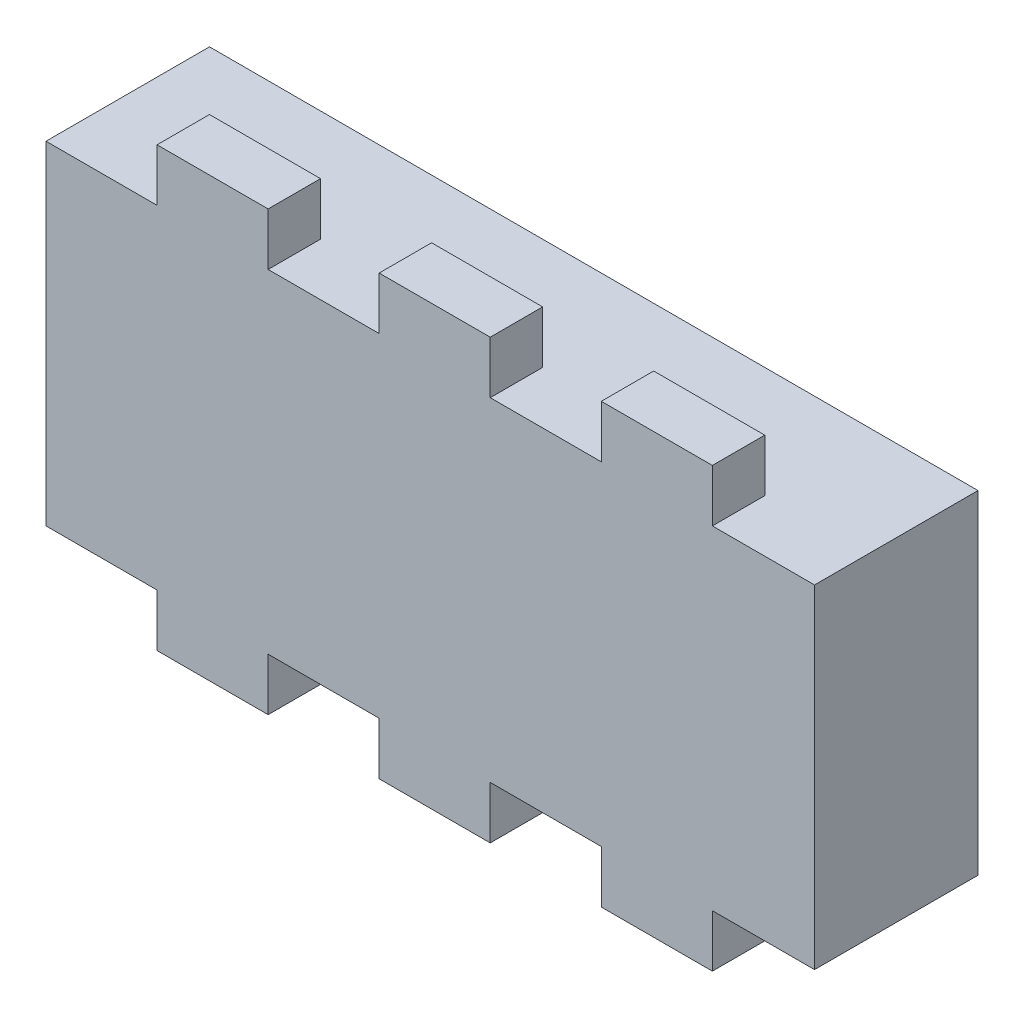
ISO-10303-21;
HEADER;
FILE_DESCRIPTION(('STEP AP214'),'2;1');
FILE_NAME('part.step','',(''),(''),'','','');
FILE_SCHEMA(('AUTOMOTIVE_DESIGN { 1 0 10303 214 1 1 1 1 }'));
ENDSEC;
DATA;
#1=APPLICATION_CONTEXT('core data for automotive mechanical design processes');
#2=APPLICATION_PROTOCOL_DEFINITION('international standard','automotive_design',2000,#1);
#3=PRODUCT_CONTEXT('',#1,'mechanical');
#4=PRODUCT('Part','Part','',(#3));
#5=PRODUCT_RELATED_PRODUCT_CATEGORY('part','',(#4));
#6=PRODUCT_DEFINITION_FORMATION('','',#4);
#7=PRODUCT_DEFINITION_CONTEXT('part definition',#1,'design');
#8=PRODUCT_DEFINITION('design','',#6,#7);
#9=PRODUCT_DEFINITION_SHAPE('','',#8);
#10=(LENGTH_UNIT() NAMED_UNIT(*) SI_UNIT(.MILLI.,.METRE.));
#11=(NAMED_UNIT(*) PLANE_ANGLE_UNIT() SI_UNIT($,.RADIAN.));
#12=(NAMED_UNIT(*) SI_UNIT($,.STERADIAN.) SOLID_ANGLE_UNIT());
#13=UNCERTAINTY_MEASURE_WITH_UNIT(LENGTH_MEASURE(1.E-05),#10,'distance_accuracy_value','');
#14=(GEOMETRIC_REPRESENTATION_CONTEXT(3) GLOBAL_UNCERTAINTY_ASSIGNED_CONTEXT((#13)) GLOBAL_UNIT_ASSIGNED_CONTEXT((#10,
#11,#12)) REPRESENTATION_CONTEXT('',''));
#15=CARTESIAN_POINT('',(0.,0.,0.));
#16=DIRECTION('',(0.,0.,1.));
#17=DIRECTION('',(1.,0.,0.));
#18=AXIS2_PLACEMENT_3D('',#15,#16,#17);
#19=CARTESIAN_POINT('',(0.,0.,-2.9972));
#20=DIRECTION('',(0.,0.,1.));
#21=DIRECTION('',(-1.,0.,0.));
#22=AXIS2_PLACEMENT_3D('',#19,#20,#21);
#23=PLANE('',#22);
#24=DIRECTION('',(-1.,0.,0.));
#25=VECTOR('',#24,1.);
#26=CARTESIAN_POINT('',(-21.971,9.525,-2.9972));
#27=LINE('',#26,#25);
#28=CARTESIAN_POINT('',(16.129,9.525,-2.9972));
#29=VERTEX_POINT('',#28);
#30=CARTESIAN_POINT('',(9.77899999999999,9.525,-2.9972));
#31=VERTEX_POINT('',#30);
#32=EDGE_CURVE('E11',#29,#31,#27,.T.);
#33=ORIENTED_EDGE('',*,*,#32,.T.);
#34=DIRECTION('',(0.,-1.,0.));
#35=VECTOR('',#34,1.);
#36=CARTESIAN_POINT('',(9.779,12.5222,-2.9972));
#37=LINE('',#36,#35);
#38=CARTESIAN_POINT('',(9.779,12.5222,-2.9972));
#39=VERTEX_POINT('',#38);
#40=EDGE_CURVE('E356',#39,#31,#37,.T.);
#41=ORIENTED_EDGE('',*,*,#40,.F.);
#42=DIRECTION('',(1.,0.,0.));
#43=VECTOR('',#42,1.);
#44=CARTESIAN_POINT('',(9.779,12.5222,-2.9972));
#45=LINE('',#44,#43);
#46=CARTESIAN_POINT('',(16.129,12.5222,-2.9972));
#47=VERTEX_POINT('',#46);
#48=EDGE_CURVE('E371',#39,#47,#45,.T.);
#49=ORIENTED_EDGE('',*,*,#48,.T.);
#50=DIRECTION('',(0.,-1.,0.));
#51=VECTOR('',#50,1.);
#52=CARTESIAN_POINT('',(16.129,12.5222,-2.9972));
#53=LINE('',#52,#51);
#54=EDGE_CURVE('E387',#47,#29,#53,.T.);
#55=ORIENTED_EDGE('',*,*,#54,.T.);
#56=EDGE_LOOP('',(#33,#41,#49,#55));
#57=FACE_BOUND('',#56,.T.);
#58=ADVANCED_FACE('F45',(#57),#23,.F.);
#59=CARTESIAN_POINT('',(3.42899999999999,9.525,-2.9972));
#60=VERTEX_POINT('',#59);
#61=CARTESIAN_POINT('',(-2.92100000000001,9.525,-2.9972));
#62=VERTEX_POINT('',#61);
#63=EDGE_CURVE('E54',#60,#62,#27,.T.);
#64=ORIENTED_EDGE('',*,*,#63,.T.);
#65=DIRECTION('',(0.,-1.,0.));
#66=VECTOR('',#65,1.);
#67=CARTESIAN_POINT('',(-2.921,12.5222,-2.9972));
#68=LINE('',#67,#66);
#69=CARTESIAN_POINT('',(-2.921,12.5222,-2.9972));
#70=VERTEX_POINT('',#69);
#71=EDGE_CURVE('E365',#70,#62,#68,.T.);
#72=ORIENTED_EDGE('',*,*,#71,.F.);
#73=DIRECTION('',(1.,0.,0.));
#74=VECTOR('',#73,1.);
#75=CARTESIAN_POINT('',(-2.921,12.5222,-2.9972));
#76=LINE('',#75,#74);
#77=CARTESIAN_POINT('',(3.429,12.5222,-2.9972));
#78=VERTEX_POINT('',#77);
#79=EDGE_CURVE('E344',#70,#78,#76,.T.);
#80=ORIENTED_EDGE('',*,*,#79,.T.);
#81=DIRECTION('',(0.,-1.,0.));
#82=VECTOR('',#81,1.);
#83=CARTESIAN_POINT('',(3.429,12.5222,-2.9972));
#84=LINE('',#83,#82);
#85=EDGE_CURVE('E362',#78,#60,#84,.T.);
#86=ORIENTED_EDGE('',*,*,#85,.T.);
#87=EDGE_LOOP('',(#64,#72,#80,#86));
#88=FACE_BOUND('',#87,.T.);
#89=ADVANCED_FACE('F474',(#88),#23,.F.);
#90=CARTESIAN_POINT('',(-9.271,9.525,-2.9972));
#91=VERTEX_POINT('',#90);
#92=CARTESIAN_POINT('',(-15.621,9.525,-2.9972));
#93=VERTEX_POINT('',#92);
#94=EDGE_CURVE('E56',#91,#93,#27,.T.);
#95=ORIENTED_EDGE('',*,*,#94,.T.);
#96=DIRECTION('',(0.,-1.,0.));
#97=VECTOR('',#96,1.);
#98=CARTESIAN_POINT('',(-15.621,12.5222,-2.9972));
#99=LINE('',#98,#97);
#100=CARTESIAN_POINT('',(-15.621,12.5222,-2.9972));
#101=VERTEX_POINT('',#100);
#102=EDGE_CURVE('E413',#101,#93,#99,.T.);
#103=ORIENTED_EDGE('',*,*,#102,.F.);
#104=DIRECTION('',(1.,0.,0.));
#105=VECTOR('',#104,1.);
#106=CARTESIAN_POINT('',(-15.621,12.5222,-2.9972));
#107=LINE('',#106,#105);
#108=CARTESIAN_POINT('',(-9.271,12.5222,-2.9972));
#109=VERTEX_POINT('',#108);
#110=EDGE_CURVE('E394',#101,#109,#107,.T.);
#111=ORIENTED_EDGE('',*,*,#110,.T.);
#112=DIRECTION('',(0.,-1.,0.));
#113=VECTOR('',#112,1.);
#114=CARTESIAN_POINT('',(-9.271,12.5222,-2.9972));
#115=LINE('',#114,#113);
#116=EDGE_CURVE('E410',#109,#91,#115,.T.);
#117=ORIENTED_EDGE('',*,*,#116,.T.);
#118=EDGE_LOOP('',(#95,#103,#111,#117));
#119=FACE_BOUND('',#118,.T.);
#120=ADVANCED_FACE('F480',(#119),#23,.F.);
#121=DIRECTION('',(1.,0.,0.));
#122=VECTOR('',#121,1.);
#123=CARTESIAN_POINT('',(-21.971,-9.525,-2.9972));
#124=LINE('',#123,#122);
#125=CARTESIAN_POINT('',(-15.621,-9.525,-2.9972));
#126=VERTEX_POINT('',#125);
#127=CARTESIAN_POINT('',(-9.271,-9.525,-2.9972));
#128=VERTEX_POINT('',#127);
#129=EDGE_CURVE('E266',#126,#128,#124,.T.);
#130=ORIENTED_EDGE('',*,*,#129,.T.);
#131=DIRECTION('',(0.,1.,0.));
#132=VECTOR('',#131,1.);
#133=CARTESIAN_POINT('',(-9.271,-12.5222,-2.9972));
#134=LINE('',#133,#132);
#135=CARTESIAN_POINT('',(-9.271,-12.5222,-2.9972));
#136=VERTEX_POINT('',#135);
#137=EDGE_CURVE('E290',#136,#128,#134,.T.);
#138=ORIENTED_EDGE('',*,*,#137,.F.);
#139=DIRECTION('',(1.,0.,0.));
#140=VECTOR('',#139,1.);
#141=CARTESIAN_POINT('',(-15.621,-12.5222,-2.9972));
#142=LINE('',#141,#140);
#143=CARTESIAN_POINT('',(-15.621,-12.5222,-2.9972));
#144=VERTEX_POINT('',#143);
#145=EDGE_CURVE('E279',#144,#136,#142,.T.);
#146=ORIENTED_EDGE('',*,*,#145,.F.);
#147=DIRECTION('',(0.,1.,0.));
#148=VECTOR('',#147,1.);
#149=CARTESIAN_POINT('',(-15.621,-12.5222,-2.9972));
#150=LINE('',#149,#148);
#151=EDGE_CURVE('E282',#144,#126,#150,.T.);
#152=ORIENTED_EDGE('',*,*,#151,.T.);
#153=EDGE_LOOP('',(#130,#138,#146,#152));
#154=FACE_BOUND('',#153,.T.);
#155=ADVANCED_FACE('F488',(#154),#23,.F.);
#156=CARTESIAN_POINT('',(-2.921,-9.525,-2.9972));
#157=VERTEX_POINT('',#156);
#158=CARTESIAN_POINT('',(3.429,-9.525,-2.9972));
#159=VERTEX_POINT('',#158);
#160=EDGE_CURVE('E268',#157,#159,#124,.T.);
#161=ORIENTED_EDGE('',*,*,#160,.T.);
#162=DIRECTION('',(0.,1.,0.));
#163=VECTOR('',#162,1.);
#164=CARTESIAN_POINT('',(3.429,-12.5222,-2.9972));
#165=LINE('',#164,#163);
#166=CARTESIAN_POINT('',(3.429,-12.5222,-2.9972));
#167=VERTEX_POINT('',#166);
#168=EDGE_CURVE('E316',#167,#159,#165,.T.);
#169=ORIENTED_EDGE('',*,*,#168,.F.);
#170=DIRECTION('',(1.,0.,0.));
#171=VECTOR('',#170,1.);
#172=CARTESIAN_POINT('',(-2.921,-12.5222,-2.9972));
#173=LINE('',#172,#171);
#174=CARTESIAN_POINT('',(-2.921,-12.5222,-2.9972));
#175=VERTEX_POINT('',#174);
#176=EDGE_CURVE('E306',#175,#167,#173,.T.);
#177=ORIENTED_EDGE('',*,*,#176,.F.);
#178=DIRECTION('',(0.,1.,0.));
#179=VECTOR('',#178,1.);
#180=CARTESIAN_POINT('',(-2.921,-12.5222,-2.9972));
#181=LINE('',#180,#179);
#182=EDGE_CURVE('E309',#175,#157,#181,.T.);
#183=ORIENTED_EDGE('',*,*,#182,.T.);
#184=EDGE_LOOP('',(#161,#169,#177,#183));
#185=FACE_BOUND('',#184,.T.);
#186=ADVANCED_FACE('F444',(#185),#23,.F.);
#187=CARTESIAN_POINT('',(9.779,-9.525,-2.9972));
#188=VERTEX_POINT('',#187);
#189=CARTESIAN_POINT('',(16.129,-9.525,-2.9972));
#190=VERTEX_POINT('',#189);
#191=EDGE_CURVE('E269',#188,#190,#124,.T.);
#192=ORIENTED_EDGE('',*,*,#191,.T.);
#193=DIRECTION('',(0.,1.,0.));
#194=VECTOR('',#193,1.);
#195=CARTESIAN_POINT('',(16.129,-12.5222,-2.9972));
#196=LINE('',#195,#194);
#197=CARTESIAN_POINT('',(16.129,-12.5222,-2.9972));
#198=VERTEX_POINT('',#197);
#199=EDGE_CURVE('E337',#198,#190,#196,.T.);
#200=ORIENTED_EDGE('',*,*,#199,.F.);
#201=DIRECTION('',(1.,0.,0.));
#202=VECTOR('',#201,1.);
#203=CARTESIAN_POINT('',(9.779,-12.5222,-2.9972));
#204=LINE('',#203,#202);
#205=CARTESIAN_POINT('',(9.779,-12.5222,-2.9972));
#206=VERTEX_POINT('',#205);
#207=EDGE_CURVE('E329',#206,#198,#204,.T.);
#208=ORIENTED_EDGE('',*,*,#207,.F.);
#209=DIRECTION('',(0.,1.,0.));
#210=VECTOR('',#209,1.);
#211=CARTESIAN_POINT('',(9.779,-12.5222,-2.9972));
#212=LINE('',#211,#210);
#213=EDGE_CURVE('E332',#206,#188,#212,.T.);
#214=ORIENTED_EDGE('',*,*,#213,.T.);
#215=EDGE_LOOP('',(#192,#200,#208,#214));
#216=FACE_BOUND('',#215,.T.);
#217=ADVANCED_FACE('F472',(#216),#23,.F.);
#218=CARTESIAN_POINT('',(-21.971,9.525,-2.9972));
#219=DIRECTION('',(0.,-1.,0.));
#220=DIRECTION('',(0.,0.,1.));
#221=AXIS2_PLACEMENT_3D('',#218,#219,#220);
#222=PLANE('',#221);
#223=DIRECTION('',(0.,0.,-1.));
#224=VECTOR('',#223,1.);
#225=CARTESIAN_POINT('',(-15.621,9.525,0.));
#226=LINE('',#225,#224);
#227=CARTESIAN_POINT('',(-15.621,9.525,0.));
#228=VERTEX_POINT('',#227);
#229=EDGE_CURVE('E368',#228,#93,#226,.T.);
#230=ORIENTED_EDGE('',*,*,#229,.T.);
#231=ORIENTED_EDGE('',*,*,#94,.F.);
#232=DIRECTION('',(0.,0.,1.));
#233=VECTOR('',#232,1.);
#234=CARTESIAN_POINT('',(-9.271,9.525,0.));
#235=LINE('',#234,#233);
#236=CARTESIAN_POINT('',(-9.271,9.525,0.));
#237=VERTEX_POINT('',#236);
#238=EDGE_CURVE('E395',#91,#237,#235,.T.);
#239=ORIENTED_EDGE('',*,*,#238,.T.);
#240=DIRECTION('',(-1.,0.,0.));
#241=VECTOR('',#240,1.);
#242=CARTESIAN_POINT('',(-21.971,9.525,0.));
#243=LINE('',#242,#241);
#244=CARTESIAN_POINT('',(-2.921,9.525,0.));
#245=VERTEX_POINT('',#244);
#246=EDGE_CURVE('E424',#245,#237,#243,.T.);
#247=ORIENTED_EDGE('',*,*,#246,.F.);
#248=DIRECTION('',(0.,0.,-1.));
#249=VECTOR('',#248,1.);
#250=CARTESIAN_POINT('',(-2.921,9.525,0.));
#251=LINE('',#250,#249);
#252=EDGE_CURVE('E354',#245,#62,#251,.T.);
#253=ORIENTED_EDGE('',*,*,#252,.T.);
#254=ORIENTED_EDGE('',*,*,#63,.F.);
#255=DIRECTION('',(0.,0.,1.));
#256=VECTOR('',#255,1.);
#257=CARTESIAN_POINT('',(3.429,9.525,0.));
#258=LINE('',#257,#256);
#259=CARTESIAN_POINT('',(3.42899999999999,9.525,0.));
#260=VERTEX_POINT('',#259);
#261=EDGE_CURVE('E345',#60,#260,#258,.T.);
#262=ORIENTED_EDGE('',*,*,#261,.T.);
#263=CARTESIAN_POINT('',(9.779,9.525,0.));
#264=VERTEX_POINT('',#263);
#265=EDGE_CURVE('E423',#264,#260,#243,.T.);
#266=ORIENTED_EDGE('',*,*,#265,.F.);
#267=DIRECTION('',(0.,0.,-1.));
#268=VECTOR('',#267,1.);
#269=CARTESIAN_POINT('',(9.779,9.525,0.));
#270=LINE('',#269,#268);
#271=EDGE_CURVE('E297',#264,#31,#270,.T.);
#272=ORIENTED_EDGE('',*,*,#271,.T.);
#273=ORIENTED_EDGE('',*,*,#32,.F.);
#274=DIRECTION('',(0.,0.,1.));
#275=VECTOR('',#274,1.);
#276=CARTESIAN_POINT('',(16.129,9.525,0.));
#277=LINE('',#276,#275);
#278=CARTESIAN_POINT('',(16.129,9.525,0.));
#279=VERTEX_POINT('',#278);
#280=EDGE_CURVE('E372',#29,#279,#277,.T.);
#281=ORIENTED_EDGE('',*,*,#280,.T.);
#282=CARTESIAN_POINT('',(21.971,9.525,0.));
#283=VERTEX_POINT('',#282);
#284=EDGE_CURVE('E419',#283,#279,#243,.T.);
#285=ORIENTED_EDGE('',*,*,#284,.F.);
#286=DIRECTION('',(0.,0.,1.));
#287=VECTOR('',#286,1.);
#288=CARTESIAN_POINT('',(21.971,9.525,-2.9972));
#289=LINE('',#288,#287);
#290=CARTESIAN_POINT('',(21.971,9.525,-9.3472));
#291=VERTEX_POINT('',#290);
#292=EDGE_CURVE('E49',#291,#283,#289,.T.);
#293=ORIENTED_EDGE('',*,*,#292,.F.);
#294=DIRECTION('',(-1.,0.,0.));
#295=VECTOR('',#294,1.);
#296=CARTESIAN_POINT('',(-21.971,9.525,-9.3472));
#297=LINE('',#296,#295);
#298=CARTESIAN_POINT('',(-21.971,9.525,-9.3472));
#299=VERTEX_POINT('',#298);
#300=EDGE_CURVE('E263',#291,#299,#297,.T.);
#301=ORIENTED_EDGE('',*,*,#300,.T.);
#302=DIRECTION('',(0.,0.,1.));
#303=VECTOR('',#302,1.);
#304=CARTESIAN_POINT('',(-21.971,9.525,-2.9972));
#305=LINE('',#304,#303);
#306=CARTESIAN_POINT('',(-21.971,9.525,0.));
#307=VERTEX_POINT('',#306);
#308=EDGE_CURVE('E254',#299,#307,#305,.T.);
#309=ORIENTED_EDGE('',*,*,#308,.T.);
#310=EDGE_CURVE('E418',#228,#307,#243,.T.);
#311=ORIENTED_EDGE('',*,*,#310,.F.);
#312=EDGE_LOOP('',(#230,#231,#239,#247,#253,#254,#262,#266,#272,#273,#281,#285,#293,#301,#309,#311));
#313=FACE_BOUND('',#312,.T.);
#314=ADVANCED_FACE('F466',(#313),#222,.F.);
#315=CARTESIAN_POINT('',(21.971,-9.525,-2.9972));
#316=DIRECTION('',(-1.,0.,0.));
#317=DIRECTION('',(0.,0.,-1.));
#318=AXIS2_PLACEMENT_3D('',#315,#316,#317);
#319=PLANE('',#318);
#320=DIRECTION('',(0.,1.,0.));
#321=VECTOR('',#320,1.);
#322=CARTESIAN_POINT('',(21.971,-9.525,0.));
#323=LINE('',#322,#321);
#324=CARTESIAN_POINT('',(21.971,-9.525,0.));
#325=VERTEX_POINT('',#324);
#326=EDGE_CURVE('E416',#325,#283,#323,.T.);
#327=ORIENTED_EDGE('',*,*,#326,.F.);
#328=DIRECTION('',(0.,0.,1.));
#329=VECTOR('',#328,1.);
#330=CARTESIAN_POINT('',(21.971,-9.525,-2.9972));
#331=LINE('',#330,#329);
#332=CARTESIAN_POINT('',(21.971,-9.525,-9.3472));
#333=VERTEX_POINT('',#332);
#334=EDGE_CURVE('E255',#333,#325,#331,.T.);
#335=ORIENTED_EDGE('',*,*,#334,.F.);
#336=DIRECTION('',(0.,1.,0.));
#337=VECTOR('',#336,1.);
#338=CARTESIAN_POINT('',(21.971,9.525,-9.3472));
#339=LINE('',#338,#337);
#340=EDGE_CURVE('E241',#333,#291,#339,.T.);
#341=ORIENTED_EDGE('',*,*,#340,.T.);
#342=ORIENTED_EDGE('',*,*,#292,.T.);
#343=EDGE_LOOP('',(#327,#335,#341,#342));
#344=FACE_BOUND('',#343,.T.);
#345=ADVANCED_FACE('F47',(#344),#319,.F.);
#346=CARTESIAN_POINT('',(-21.971,-9.525,-2.9972));
#347=DIRECTION('',(1.,0.,0.));
#348=DIRECTION('',(0.,0.,1.));
#349=AXIS2_PLACEMENT_3D('',#346,#347,#348);
#350=PLANE('',#349);
#351=DIRECTION('',(0.,-1.,0.));
#352=VECTOR('',#351,1.);
#353=CARTESIAN_POINT('',(-21.971,-9.525,0.));
#354=LINE('',#353,#352);
#355=CARTESIAN_POINT('',(-21.971,-9.525,0.));
#356=VERTEX_POINT('',#355);
#357=EDGE_CURVE('E422',#307,#356,#354,.T.);
#358=ORIENTED_EDGE('',*,*,#357,.F.);
#359=ORIENTED_EDGE('',*,*,#308,.F.);
#360=DIRECTION('',(0.,-1.,0.));
#361=VECTOR('',#360,1.);
#362=CARTESIAN_POINT('',(-21.971,9.525,-9.3472));
#363=LINE('',#362,#361);
#364=CARTESIAN_POINT('',(-21.971,-9.525,-9.3472));
#365=VERTEX_POINT('',#364);
#366=EDGE_CURVE('E239',#299,#365,#363,.T.);
#367=ORIENTED_EDGE('',*,*,#366,.T.);
#368=DIRECTION('',(0.,0.,1.));
#369=VECTOR('',#368,1.);
#370=CARTESIAN_POINT('',(-21.971,-9.525,-2.9972));
#371=LINE('',#370,#369);
#372=EDGE_CURVE('E247',#365,#356,#371,.T.);
#373=ORIENTED_EDGE('',*,*,#372,.T.);
#374=EDGE_LOOP('',(#358,#359,#367,#373));
#375=FACE_BOUND('',#374,.T.);
#376=ADVANCED_FACE('F257',(#375),#350,.F.);
#377=CARTESIAN_POINT('',(-21.971,-9.525,-2.9972));
#378=DIRECTION('',(0.,1.,0.));
#379=DIRECTION('',(0.,0.,-1.));
#380=AXIS2_PLACEMENT_3D('',#377,#378,#379);
#381=PLANE('',#380);
#382=ORIENTED_EDGE('',*,*,#334,.T.);
#383=DIRECTION('',(1.,0.,0.));
#384=VECTOR('',#383,1.);
#385=CARTESIAN_POINT('',(-21.971,-9.525,0.));
#386=LINE('',#385,#384);
#387=CARTESIAN_POINT('',(16.129,-9.525,0.));
#388=VERTEX_POINT('',#387);
#389=EDGE_CURVE('E426',#388,#325,#386,.T.);
#390=ORIENTED_EDGE('',*,*,#389,.F.);
#391=DIRECTION('',(0.,0.,1.));
#392=VECTOR('',#391,1.);
#393=CARTESIAN_POINT('',(16.129,-9.525,0.));
#394=LINE('',#393,#392);
#395=EDGE_CURVE('E324',#190,#388,#394,.T.);
#396=ORIENTED_EDGE('',*,*,#395,.F.);
#397=ORIENTED_EDGE('',*,*,#191,.F.);
#398=DIRECTION('',(0.,0.,-1.));
#399=VECTOR('',#398,1.);
#400=CARTESIAN_POINT('',(9.779,-9.525,0.));
#401=LINE('',#400,#399);
#402=CARTESIAN_POINT('',(9.779,-9.525,0.));
#403=VERTEX_POINT('',#402);
#404=EDGE_CURVE('E265',#403,#188,#401,.T.);
#405=ORIENTED_EDGE('',*,*,#404,.F.);
#406=CARTESIAN_POINT('',(3.42899999999999,-9.525,0.));
#407=VERTEX_POINT('',#406);
#408=EDGE_CURVE('E451',#407,#403,#386,.T.);
#409=ORIENTED_EDGE('',*,*,#408,.F.);
#410=DIRECTION('',(0.,0.,1.));
#411=VECTOR('',#410,1.);
#412=CARTESIAN_POINT('',(3.429,-9.525,0.));
#413=LINE('',#412,#411);
#414=EDGE_CURVE('E301',#159,#407,#413,.T.);
#415=ORIENTED_EDGE('',*,*,#414,.F.);
#416=ORIENTED_EDGE('',*,*,#160,.F.);
#417=DIRECTION('',(0.,0.,-1.));
#418=VECTOR('',#417,1.);
#419=CARTESIAN_POINT('',(-2.921,-9.525,0.));
#420=LINE('',#419,#418);
#421=CARTESIAN_POINT('',(-2.921,-9.525,0.));
#422=VERTEX_POINT('',#421);
#423=EDGE_CURVE('E310',#422,#157,#420,.T.);
#424=ORIENTED_EDGE('',*,*,#423,.F.);
#425=CARTESIAN_POINT('',(-9.271,-9.525,0.));
#426=VERTEX_POINT('',#425);
#427=EDGE_CURVE('E428',#426,#422,#386,.T.);
#428=ORIENTED_EDGE('',*,*,#427,.F.);
#429=DIRECTION('',(0.,0.,1.));
#430=VECTOR('',#429,1.);
#431=CARTESIAN_POINT('',(-9.271,-9.525,0.));
#432=LINE('',#431,#430);
#433=EDGE_CURVE('E274',#128,#426,#432,.T.);
#434=ORIENTED_EDGE('',*,*,#433,.F.);
#435=ORIENTED_EDGE('',*,*,#129,.F.);
#436=DIRECTION('',(0.,0.,-1.));
#437=VECTOR('',#436,1.);
#438=CARTESIAN_POINT('',(-15.621,-9.525,0.));
#439=LINE('',#438,#437);
#440=CARTESIAN_POINT('',(-15.621,-9.525,0.));
#441=VERTEX_POINT('',#440);
#442=EDGE_CURVE('E283',#441,#126,#439,.T.);
#443=ORIENTED_EDGE('',*,*,#442,.F.);
#444=EDGE_CURVE('E251',#356,#441,#386,.T.);
#445=ORIENTED_EDGE('',*,*,#444,.F.);
#446=ORIENTED_EDGE('',*,*,#372,.F.);
#447=DIRECTION('',(1.,0.,0.));
#448=VECTOR('',#447,1.);
#449=CARTESIAN_POINT('',(-21.971,-9.525,-9.3472));
#450=LINE('',#449,#448);
#451=EDGE_CURVE('E234',#365,#333,#450,.T.);
#452=ORIENTED_EDGE('',*,*,#451,.T.);
#453=EDGE_LOOP('',(#382,#390,#396,#397,#405,#409,#415,#416,#424,#428,#434,#435,#443,#445,#446,#452));
#454=FACE_BOUND('',#453,.T.);
#455=ADVANCED_FACE('F248',(#454),#381,.F.);
#456=CARTESIAN_POINT('',(0.,0.,0.));
#457=DIRECTION('',(0.,0.,1.));
#458=DIRECTION('',(-1.,0.,0.));
#459=AXIS2_PLACEMENT_3D('',#456,#457,#458);
#460=PLANE('',#459);
#461=ORIENTED_EDGE('',*,*,#326,.T.);
#462=ORIENTED_EDGE('',*,*,#284,.T.);
#463=DIRECTION('',(0.,-1.,0.));
#464=VECTOR('',#463,1.);
#465=CARTESIAN_POINT('',(16.129,12.5222,0.));
#466=LINE('',#465,#464);
#467=CARTESIAN_POINT('',(16.129,12.5222,0.));
#468=VERTEX_POINT('',#467);
#469=EDGE_CURVE('E385',#468,#279,#466,.T.);
#470=ORIENTED_EDGE('',*,*,#469,.F.);
#471=DIRECTION('',(-1.,0.,0.));
#472=VECTOR('',#471,1.);
#473=CARTESIAN_POINT('',(9.779,12.5222,0.));
#474=LINE('',#473,#472);
#475=CARTESIAN_POINT('',(9.779,12.5222,0.));
#476=VERTEX_POINT('',#475);
#477=EDGE_CURVE('E377',#468,#476,#474,.T.);
#478=ORIENTED_EDGE('',*,*,#477,.T.);
#479=DIRECTION('',(0.,-1.,0.));
#480=VECTOR('',#479,1.);
#481=CARTESIAN_POINT('',(9.779,12.5222,0.));
#482=LINE('',#481,#480);
#483=EDGE_CURVE('E380',#476,#264,#482,.T.);
#484=ORIENTED_EDGE('',*,*,#483,.T.);
#485=ORIENTED_EDGE('',*,*,#265,.T.);
#486=DIRECTION('',(0.,-1.,0.));
#487=VECTOR('',#486,1.);
#488=CARTESIAN_POINT('',(3.429,12.5222,0.));
#489=LINE('',#488,#487);
#490=CARTESIAN_POINT('',(3.429,12.5222,0.));
#491=VERTEX_POINT('',#490);
#492=EDGE_CURVE('E360',#491,#260,#489,.T.);
#493=ORIENTED_EDGE('',*,*,#492,.F.);
#494=DIRECTION('',(-1.,0.,0.));
#495=VECTOR('',#494,1.);
#496=CARTESIAN_POINT('',(-2.921,12.5222,0.));
#497=LINE('',#496,#495);
#498=CARTESIAN_POINT('',(-2.921,12.5222,0.));
#499=VERTEX_POINT('',#498);
#500=EDGE_CURVE('E350',#491,#499,#497,.T.);
#501=ORIENTED_EDGE('',*,*,#500,.T.);
#502=DIRECTION('',(0.,-1.,0.));
#503=VECTOR('',#502,1.);
#504=CARTESIAN_POINT('',(-2.921,12.5222,0.));
#505=LINE('',#504,#503);
#506=EDGE_CURVE('E353',#499,#245,#505,.T.);
#507=ORIENTED_EDGE('',*,*,#506,.T.);
#508=ORIENTED_EDGE('',*,*,#246,.T.);
#509=DIRECTION('',(0.,-1.,0.));
#510=VECTOR('',#509,1.);
#511=CARTESIAN_POINT('',(-9.271,12.5222,0.));
#512=LINE('',#511,#510);
#513=CARTESIAN_POINT('',(-9.271,12.5222,0.));
#514=VERTEX_POINT('',#513);
#515=EDGE_CURVE('E408',#514,#237,#512,.T.);
#516=ORIENTED_EDGE('',*,*,#515,.F.);
#517=DIRECTION('',(-1.,0.,0.));
#518=VECTOR('',#517,1.);
#519=CARTESIAN_POINT('',(-15.621,12.5222,0.));
#520=LINE('',#519,#518);
#521=CARTESIAN_POINT('',(-15.621,12.5222,0.));
#522=VERTEX_POINT('',#521);
#523=EDGE_CURVE('E400',#514,#522,#520,.T.);
#524=ORIENTED_EDGE('',*,*,#523,.T.);
#525=DIRECTION('',(0.,-1.,0.));
#526=VECTOR('',#525,1.);
#527=CARTESIAN_POINT('',(-15.621,12.5222,0.));
#528=LINE('',#527,#526);
#529=EDGE_CURVE('E403',#522,#228,#528,.T.);
#530=ORIENTED_EDGE('',*,*,#529,.T.);
#531=ORIENTED_EDGE('',*,*,#310,.T.);
#532=ORIENTED_EDGE('',*,*,#357,.T.);
#533=ORIENTED_EDGE('',*,*,#444,.T.);
#534=DIRECTION('',(0.,1.,0.));
#535=VECTOR('',#534,1.);
#536=CARTESIAN_POINT('',(-15.621,-12.5222,0.));
#537=LINE('',#536,#535);
#538=CARTESIAN_POINT('',(-15.621,-12.5222,0.));
#539=VERTEX_POINT('',#538);
#540=EDGE_CURVE('E295',#539,#441,#537,.T.);
#541=ORIENTED_EDGE('',*,*,#540,.F.);
#542=DIRECTION('',(-1.,0.,0.));
#543=VECTOR('',#542,1.);
#544=CARTESIAN_POINT('',(-15.621,-12.5222,0.));
#545=LINE('',#544,#543);
#546=CARTESIAN_POINT('',(-9.271,-12.5222,0.));
#547=VERTEX_POINT('',#546);
#548=EDGE_CURVE('E273',#547,#539,#545,.T.);
#549=ORIENTED_EDGE('',*,*,#548,.F.);
#550=DIRECTION('',(0.,1.,0.));
#551=VECTOR('',#550,1.);
#552=CARTESIAN_POINT('',(-9.271,-12.5222,0.));
#553=LINE('',#552,#551);
#554=EDGE_CURVE('E293',#547,#426,#553,.T.);
#555=ORIENTED_EDGE('',*,*,#554,.T.);
#556=ORIENTED_EDGE('',*,*,#427,.T.);
#557=DIRECTION('',(0.,1.,0.));
#558=VECTOR('',#557,1.);
#559=CARTESIAN_POINT('',(-2.921,-12.5222,0.));
#560=LINE('',#559,#558);
#561=CARTESIAN_POINT('',(-2.921,-12.5222,0.));
#562=VERTEX_POINT('',#561);
#563=EDGE_CURVE('E285',#562,#422,#560,.T.);
#564=ORIENTED_EDGE('',*,*,#563,.F.);
#565=DIRECTION('',(-1.,0.,0.));
#566=VECTOR('',#565,1.);
#567=CARTESIAN_POINT('',(-2.921,-12.5222,0.));
#568=LINE('',#567,#566);
#569=CARTESIAN_POINT('',(3.429,-12.5222,0.));
#570=VERTEX_POINT('',#569);
#571=EDGE_CURVE('E300',#570,#562,#568,.T.);
#572=ORIENTED_EDGE('',*,*,#571,.F.);
#573=DIRECTION('',(0.,1.,0.));
#574=VECTOR('',#573,1.);
#575=CARTESIAN_POINT('',(3.429,-12.5222,0.));
#576=LINE('',#575,#574);
#577=EDGE_CURVE('E70',#570,#407,#576,.T.);
#578=ORIENTED_EDGE('',*,*,#577,.T.);
#579=ORIENTED_EDGE('',*,*,#408,.T.);
#580=DIRECTION('',(0.,1.,0.));
#581=VECTOR('',#580,1.);
#582=CARTESIAN_POINT('',(9.779,-12.5222,0.));
#583=LINE('',#582,#581);
#584=CARTESIAN_POINT('',(9.779,-12.5222,0.));
#585=VERTEX_POINT('',#584);
#586=EDGE_CURVE('E312',#585,#403,#583,.T.);
#587=ORIENTED_EDGE('',*,*,#586,.F.);
#588=DIRECTION('',(-1.,0.,0.));
#589=VECTOR('',#588,1.);
#590=CARTESIAN_POINT('',(9.779,-12.5222,0.));
#591=LINE('',#590,#589);
#592=CARTESIAN_POINT('',(16.129,-12.5222,0.));
#593=VERTEX_POINT('',#592);
#594=EDGE_CURVE('E323',#593,#585,#591,.T.);
#595=ORIENTED_EDGE('',*,*,#594,.F.);
#596=DIRECTION('',(0.,1.,0.));
#597=VECTOR('',#596,1.);
#598=CARTESIAN_POINT('',(16.129,-12.5222,0.));
#599=LINE('',#598,#597);
#600=EDGE_CURVE('E63',#593,#388,#599,.T.);
#601=ORIENTED_EDGE('',*,*,#600,.T.);
#602=ORIENTED_EDGE('',*,*,#389,.T.);
#603=EDGE_LOOP('',(#461,#462,#470,#478,#484,#485,#493,#501,#507,#508,#516,#524,#530,#531,#532,
#533,#541,#549,#555,#556,#564,#572,#578,#579,#587,#595,#601,#602));
#604=FACE_BOUND('',#603,.T.);
#605=ADVANCED_FACE('F460',(#604),#460,.T.);
#606=CARTESIAN_POINT('',(-15.621,12.5222,0.));
#607=DIRECTION('',(1.,0.,0.));
#608=DIRECTION('',(0.,0.,1.));
#609=AXIS2_PLACEMENT_3D('',#606,#607,#608);
#610=PLANE('',#609);
#611=ORIENTED_EDGE('',*,*,#229,.F.);
#612=ORIENTED_EDGE('',*,*,#529,.F.);
#613=DIRECTION('',(0.,0.,-1.));
#614=VECTOR('',#613,1.);
#615=CARTESIAN_POINT('',(-15.621,12.5222,0.));
#616=LINE('',#615,#614);
#617=EDGE_CURVE('E392',#522,#101,#616,.T.);
#618=ORIENTED_EDGE('',*,*,#617,.T.);
#619=ORIENTED_EDGE('',*,*,#102,.T.);
#620=EDGE_LOOP('',(#611,#612,#618,#619));
#621=FACE_BOUND('',#620,.T.);
#622=ADVANCED_FACE('F544',(#621),#610,.F.);
#623=CARTESIAN_POINT('',(-9.271,12.5222,0.));
#624=DIRECTION('',(-1.,0.,0.));
#625=DIRECTION('',(0.,0.,-1.));
#626=AXIS2_PLACEMENT_3D('',#623,#624,#625);
#627=PLANE('',#626);
#628=ORIENTED_EDGE('',*,*,#238,.F.);
#629=ORIENTED_EDGE('',*,*,#116,.F.);
#630=DIRECTION('',(0.,0.,1.));
#631=VECTOR('',#630,1.);
#632=CARTESIAN_POINT('',(-9.271,12.5222,0.));
#633=LINE('',#632,#631);
#634=EDGE_CURVE('E398',#109,#514,#633,.T.);
#635=ORIENTED_EDGE('',*,*,#634,.T.);
#636=ORIENTED_EDGE('',*,*,#515,.T.);
#637=EDGE_LOOP('',(#628,#629,#635,#636));
#638=FACE_BOUND('',#637,.T.);
#639=ADVANCED_FACE('F537',(#638),#627,.F.);
#640=CARTESIAN_POINT('',(0.,12.5222,0.));
#641=DIRECTION('',(0.,1.,0.));
#642=DIRECTION('',(0.,0.,-1.));
#643=AXIS2_PLACEMENT_3D('',#640,#641,#642);
#644=PLANE('',#643);
#645=ORIENTED_EDGE('',*,*,#617,.F.);
#646=ORIENTED_EDGE('',*,*,#523,.F.);
#647=ORIENTED_EDGE('',*,*,#634,.F.);
#648=ORIENTED_EDGE('',*,*,#110,.F.);
#649=EDGE_LOOP('',(#645,#646,#647,#648));
#650=FACE_BOUND('',#649,.T.);
#651=ADVANCED_FACE('F541',(#650),#644,.T.);
#652=CARTESIAN_POINT('',(9.779,12.5222,0.));
#653=DIRECTION('',(1.,0.,0.));
#654=DIRECTION('',(0.,0.,1.));
#655=AXIS2_PLACEMENT_3D('',#652,#653,#654);
#656=PLANE('',#655);
#657=ORIENTED_EDGE('',*,*,#271,.F.);
#658=ORIENTED_EDGE('',*,*,#483,.F.);
#659=DIRECTION('',(0.,0.,-1.));
#660=VECTOR('',#659,1.);
#661=CARTESIAN_POINT('',(9.779,12.5222,0.));
#662=LINE('',#661,#660);
#663=EDGE_CURVE('E369',#476,#39,#662,.T.);
#664=ORIENTED_EDGE('',*,*,#663,.T.);
#665=ORIENTED_EDGE('',*,*,#40,.T.);
#666=EDGE_LOOP('',(#657,#658,#664,#665));
#667=FACE_BOUND('',#666,.T.);
#668=ADVANCED_FACE('F554',(#667),#656,.F.);
#669=CARTESIAN_POINT('',(16.129,12.5222,0.));
#670=DIRECTION('',(-1.,0.,0.));
#671=DIRECTION('',(0.,0.,-1.));
#672=AXIS2_PLACEMENT_3D('',#669,#670,#671);
#673=PLANE('',#672);
#674=ORIENTED_EDGE('',*,*,#280,.F.);
#675=ORIENTED_EDGE('',*,*,#54,.F.);
#676=DIRECTION('',(0.,0.,1.));
#677=VECTOR('',#676,1.);
#678=CARTESIAN_POINT('',(16.129,12.5222,0.));
#679=LINE('',#678,#677);
#680=EDGE_CURVE('E375',#47,#468,#679,.T.);
#681=ORIENTED_EDGE('',*,*,#680,.T.);
#682=ORIENTED_EDGE('',*,*,#469,.T.);
#683=EDGE_LOOP('',(#674,#675,#681,#682));
#684=FACE_BOUND('',#683,.T.);
#685=ADVANCED_FACE('F557',(#684),#673,.F.);
#686=CARTESIAN_POINT('',(25.4,12.5222,0.));
#687=DIRECTION('',(0.,1.,0.));
#688=DIRECTION('',(0.,0.,-1.));
#689=AXIS2_PLACEMENT_3D('',#686,#687,#688);
#690=PLANE('',#689);
#691=ORIENTED_EDGE('',*,*,#663,.F.);
#692=ORIENTED_EDGE('',*,*,#477,.F.);
#693=ORIENTED_EDGE('',*,*,#680,.F.);
#694=ORIENTED_EDGE('',*,*,#48,.F.);
#695=EDGE_LOOP('',(#691,#692,#693,#694));
#696=FACE_BOUND('',#695,.T.);
#697=ADVANCED_FACE('F561',(#696),#690,.T.);
#698=CARTESIAN_POINT('',(-2.921,12.5222,0.));
#699=DIRECTION('',(1.,0.,0.));
#700=DIRECTION('',(0.,0.,1.));
#701=AXIS2_PLACEMENT_3D('',#698,#699,#700);
#702=PLANE('',#701);
#703=ORIENTED_EDGE('',*,*,#252,.F.);
#704=ORIENTED_EDGE('',*,*,#506,.F.);
#705=DIRECTION('',(0.,0.,-1.));
#706=VECTOR('',#705,1.);
#707=CARTESIAN_POINT('',(-2.921,12.5222,0.));
#708=LINE('',#707,#706);
#709=EDGE_CURVE('E342',#499,#70,#708,.T.);
#710=ORIENTED_EDGE('',*,*,#709,.T.);
#711=ORIENTED_EDGE('',*,*,#71,.T.);
#712=EDGE_LOOP('',(#703,#704,#710,#711));
#713=FACE_BOUND('',#712,.T.);
#714=ADVANCED_FACE('F532',(#713),#702,.F.);
#715=CARTESIAN_POINT('',(3.429,12.5222,0.));
#716=DIRECTION('',(-1.,0.,0.));
#717=DIRECTION('',(0.,0.,-1.));
#718=AXIS2_PLACEMENT_3D('',#715,#716,#717);
#719=PLANE('',#718);
#720=ORIENTED_EDGE('',*,*,#261,.F.);
#721=ORIENTED_EDGE('',*,*,#85,.F.);
#722=DIRECTION('',(0.,0.,1.));
#723=VECTOR('',#722,1.);
#724=CARTESIAN_POINT('',(3.429,12.5222,0.));
#725=LINE('',#724,#723);
#726=EDGE_CURVE('E348',#78,#491,#725,.T.);
#727=ORIENTED_EDGE('',*,*,#726,.T.);
#728=ORIENTED_EDGE('',*,*,#492,.T.);
#729=EDGE_LOOP('',(#720,#721,#727,#728));
#730=FACE_BOUND('',#729,.T.);
#731=ADVANCED_FACE('F521',(#730),#719,.F.);
#732=CARTESIAN_POINT('',(12.7,12.5222,0.));
#733=DIRECTION('',(0.,1.,0.));
#734=DIRECTION('',(0.,0.,-1.));
#735=AXIS2_PLACEMENT_3D('',#732,#733,#734);
#736=PLANE('',#735);
#737=ORIENTED_EDGE('',*,*,#709,.F.);
#738=ORIENTED_EDGE('',*,*,#500,.F.);
#739=ORIENTED_EDGE('',*,*,#726,.F.);
#740=ORIENTED_EDGE('',*,*,#79,.F.);
#741=EDGE_LOOP('',(#737,#738,#739,#740));
#742=FACE_BOUND('',#741,.T.);
#743=ADVANCED_FACE('F525',(#742),#736,.T.);
#744=CARTESIAN_POINT('',(9.779,-12.5222,0.));
#745=DIRECTION('',(-1.,0.,0.));
#746=DIRECTION('',(0.,0.,-1.));
#747=AXIS2_PLACEMENT_3D('',#744,#745,#746);
#748=PLANE('',#747);
#749=ORIENTED_EDGE('',*,*,#404,.T.);
#750=ORIENTED_EDGE('',*,*,#213,.F.);
#751=DIRECTION('',(0.,0.,-1.));
#752=VECTOR('',#751,1.);
#753=CARTESIAN_POINT('',(9.779,-12.5222,0.));
#754=LINE('',#753,#752);
#755=EDGE_CURVE('E321',#585,#206,#754,.T.);
#756=ORIENTED_EDGE('',*,*,#755,.F.);
#757=ORIENTED_EDGE('',*,*,#586,.T.);
#758=EDGE_LOOP('',(#749,#750,#756,#757));
#759=FACE_BOUND('',#758,.T.);
#760=ADVANCED_FACE('F572',(#759),#748,.T.);
#761=CARTESIAN_POINT('',(16.129,-12.5222,0.));
#762=DIRECTION('',(1.,0.,0.));
#763=DIRECTION('',(0.,0.,1.));
#764=AXIS2_PLACEMENT_3D('',#761,#762,#763);
#765=PLANE('',#764);
#766=ORIENTED_EDGE('',*,*,#395,.T.);
#767=ORIENTED_EDGE('',*,*,#600,.F.);
#768=DIRECTION('',(0.,0.,1.));
#769=VECTOR('',#768,1.);
#770=CARTESIAN_POINT('',(16.129,-12.5222,0.));
#771=LINE('',#770,#769);
#772=EDGE_CURVE('E327',#198,#593,#771,.T.);
#773=ORIENTED_EDGE('',*,*,#772,.F.);
#774=ORIENTED_EDGE('',*,*,#199,.T.);
#775=EDGE_LOOP('',(#766,#767,#773,#774));
#776=FACE_BOUND('',#775,.T.);
#777=ADVANCED_FACE('F575',(#776),#765,.T.);
#778=CARTESIAN_POINT('',(25.4,-12.5222,0.));
#779=DIRECTION('',(0.,-1.,0.));
#780=DIRECTION('',(0.,0.,-1.));
#781=AXIS2_PLACEMENT_3D('',#778,#779,#780);
#782=PLANE('',#781);
#783=ORIENTED_EDGE('',*,*,#755,.T.);
#784=ORIENTED_EDGE('',*,*,#207,.T.);
#785=ORIENTED_EDGE('',*,*,#772,.T.);
#786=ORIENTED_EDGE('',*,*,#594,.T.);
#787=EDGE_LOOP('',(#783,#784,#785,#786));
#788=FACE_BOUND('',#787,.T.);
#789=ADVANCED_FACE('F579',(#788),#782,.T.);
#790=CARTESIAN_POINT('',(-2.921,-12.5222,0.));
#791=DIRECTION('',(-1.,0.,0.));
#792=DIRECTION('',(0.,0.,-1.));
#793=AXIS2_PLACEMENT_3D('',#790,#791,#792);
#794=PLANE('',#793);
#795=ORIENTED_EDGE('',*,*,#423,.T.);
#796=ORIENTED_EDGE('',*,*,#182,.F.);
#797=DIRECTION('',(0.,0.,-1.));
#798=VECTOR('',#797,1.);
#799=CARTESIAN_POINT('',(-2.921,-12.5222,0.));
#800=LINE('',#799,#798);
#801=EDGE_CURVE('E298',#562,#175,#800,.T.);
#802=ORIENTED_EDGE('',*,*,#801,.F.);
#803=ORIENTED_EDGE('',*,*,#563,.T.);
#804=EDGE_LOOP('',(#795,#796,#802,#803));
#805=FACE_BOUND('',#804,.T.);
#806=ADVANCED_FACE('F458',(#805),#794,.T.);
#807=CARTESIAN_POINT('',(3.429,-12.5222,0.));
#808=DIRECTION('',(1.,0.,0.));
#809=DIRECTION('',(0.,0.,1.));
#810=AXIS2_PLACEMENT_3D('',#807,#808,#809);
#811=PLANE('',#810);
#812=ORIENTED_EDGE('',*,*,#414,.T.);
#813=ORIENTED_EDGE('',*,*,#577,.F.);
#814=DIRECTION('',(0.,0.,1.));
#815=VECTOR('',#814,1.);
#816=CARTESIAN_POINT('',(3.429,-12.5222,0.));
#817=LINE('',#816,#815);
#818=EDGE_CURVE('E304',#167,#570,#817,.T.);
#819=ORIENTED_EDGE('',*,*,#818,.F.);
#820=ORIENTED_EDGE('',*,*,#168,.T.);
#821=EDGE_LOOP('',(#812,#813,#819,#820));
#822=FACE_BOUND('',#821,.T.);
#823=ADVANCED_FACE('F453',(#822),#811,.T.);
#824=CARTESIAN_POINT('',(12.7,-12.5222,0.));
#825=DIRECTION('',(0.,-1.,0.));
#826=DIRECTION('',(0.,0.,-1.));
#827=AXIS2_PLACEMENT_3D('',#824,#825,#826);
#828=PLANE('',#827);
#829=ORIENTED_EDGE('',*,*,#801,.T.);
#830=ORIENTED_EDGE('',*,*,#176,.T.);
#831=ORIENTED_EDGE('',*,*,#818,.T.);
#832=ORIENTED_EDGE('',*,*,#571,.T.);
#833=EDGE_LOOP('',(#829,#830,#831,#832));
#834=FACE_BOUND('',#833,.T.);
#835=ADVANCED_FACE('F455',(#834),#828,.T.);
#836=CARTESIAN_POINT('',(-15.621,-12.5222,0.));
#837=DIRECTION('',(-1.,0.,0.));
#838=DIRECTION('',(0.,0.,-1.));
#839=AXIS2_PLACEMENT_3D('',#836,#837,#838);
#840=PLANE('',#839);
#841=ORIENTED_EDGE('',*,*,#442,.T.);
#842=ORIENTED_EDGE('',*,*,#151,.F.);
#843=DIRECTION('',(0.,0.,-1.));
#844=VECTOR('',#843,1.);
#845=CARTESIAN_POINT('',(-15.621,-12.5222,0.));
#846=LINE('',#845,#844);
#847=EDGE_CURVE('E271',#539,#144,#846,.T.);
#848=ORIENTED_EDGE('',*,*,#847,.F.);
#849=ORIENTED_EDGE('',*,*,#540,.T.);
#850=EDGE_LOOP('',(#841,#842,#848,#849));
#851=FACE_BOUND('',#850,.T.);
#852=ADVANCED_FACE('F507',(#851),#840,.T.);
#853=CARTESIAN_POINT('',(-9.271,-12.5222,0.));
#854=DIRECTION('',(1.,0.,0.));
#855=DIRECTION('',(0.,0.,1.));
#856=AXIS2_PLACEMENT_3D('',#853,#854,#855);
#857=PLANE('',#856);
#858=ORIENTED_EDGE('',*,*,#433,.T.);
#859=ORIENTED_EDGE('',*,*,#554,.F.);
#860=DIRECTION('',(0.,0.,1.));
#861=VECTOR('',#860,1.);
#862=CARTESIAN_POINT('',(-9.271,-12.5222,0.));
#863=LINE('',#862,#861);
#864=EDGE_CURVE('E277',#136,#547,#863,.T.);
#865=ORIENTED_EDGE('',*,*,#864,.F.);
#866=ORIENTED_EDGE('',*,*,#137,.T.);
#867=EDGE_LOOP('',(#858,#859,#865,#866));
#868=FACE_BOUND('',#867,.T.);
#869=ADVANCED_FACE('F502',(#868),#857,.T.);
#870=CARTESIAN_POINT('',(0.,-12.5222,0.));
#871=DIRECTION('',(0.,-1.,0.));
#872=DIRECTION('',(0.,0.,-1.));
#873=AXIS2_PLACEMENT_3D('',#870,#871,#872);
#874=PLANE('',#873);
#875=ORIENTED_EDGE('',*,*,#847,.T.);
#876=ORIENTED_EDGE('',*,*,#145,.T.);
#877=ORIENTED_EDGE('',*,*,#864,.T.);
#878=ORIENTED_EDGE('',*,*,#548,.T.);
#879=EDGE_LOOP('',(#875,#876,#877,#878));
#880=FACE_BOUND('',#879,.T.);
#881=ADVANCED_FACE('F504',(#880),#874,.T.);
#882=CARTESIAN_POINT('',(0.,0.,-9.3472));
#883=DIRECTION('',(0.,0.,-1.));
#884=DIRECTION('',(1.,0.,0.));
#885=AXIS2_PLACEMENT_3D('',#882,#883,#884);
#886=PLANE('',#885);
#887=ORIENTED_EDGE('',*,*,#366,.F.);
#888=ORIENTED_EDGE('',*,*,#300,.F.);
#889=ORIENTED_EDGE('',*,*,#340,.F.);
#890=ORIENTED_EDGE('',*,*,#451,.F.);
#891=EDGE_LOOP('',(#887,#888,#889,#890));
#892=FACE_BOUND('',#891,.T.);
#893=ADVANCED_FACE('F236',(#892),#886,.T.);
#894=CLOSED_SHELL('',(#58,#89,#120,#155,#186,#217,#314,#345,#376,#455,#605,#622,#639,#651,#668,
#685,#697,#714,#731,#743,#760,#777,#789,#806,#823,#835,#852,#869,#881,#893));
#895=MANIFOLD_SOLID_BREP('B2',#894);
#896=ADVANCED_BREP_SHAPE_REPRESENTATION('',(#18,#895),#14);
#897=SHAPE_DEFINITION_REPRESENTATION(#9,#896);
ENDSEC;
END-ISO-10303-21;
